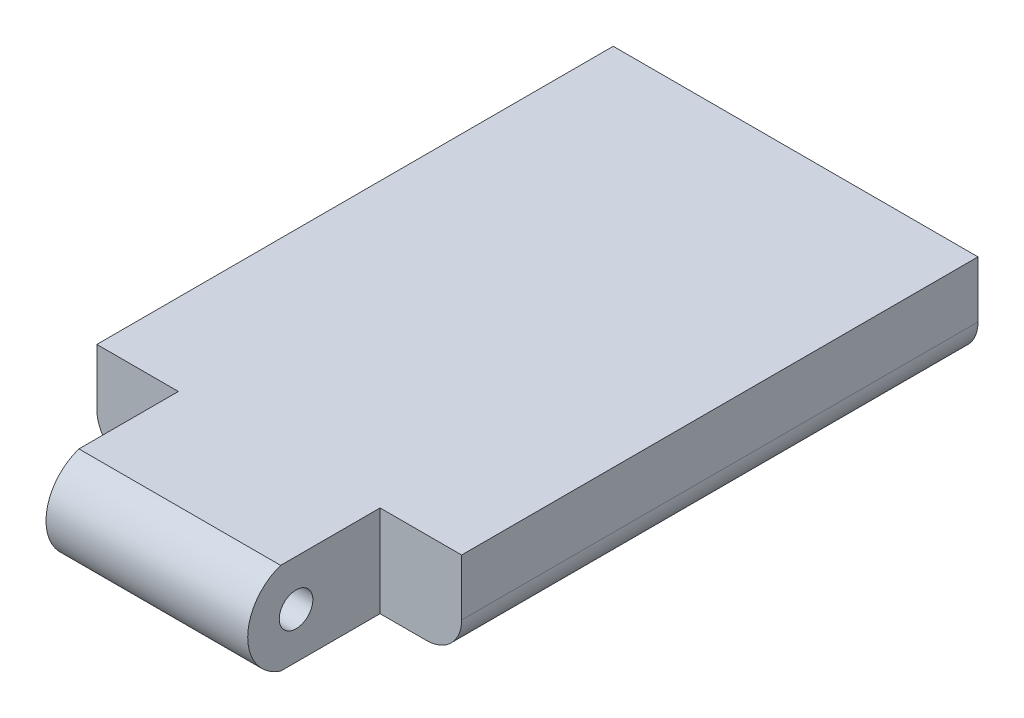
ISO-10303-21;
HEADER;
FILE_DESCRIPTION(('STEP AP214'),'2;1');
FILE_NAME('part.step','',(''),(''),'','','');
FILE_SCHEMA(('AUTOMOTIVE_DESIGN { 1 0 10303 214 1 1 1 1 }'));
ENDSEC;
DATA;
#1=APPLICATION_CONTEXT('core data for automotive mechanical design processes');
#2=APPLICATION_PROTOCOL_DEFINITION('international standard','automotive_design',2000,#1);
#3=PRODUCT_CONTEXT('',#1,'mechanical');
#4=PRODUCT('Part','Part','',(#3));
#5=PRODUCT_RELATED_PRODUCT_CATEGORY('part','',(#4));
#6=PRODUCT_DEFINITION_FORMATION('','',#4);
#7=PRODUCT_DEFINITION_CONTEXT('part definition',#1,'design');
#8=PRODUCT_DEFINITION('design','',#6,#7);
#9=PRODUCT_DEFINITION_SHAPE('','',#8);
#10=(LENGTH_UNIT() NAMED_UNIT(*) SI_UNIT(.MILLI.,.METRE.));
#11=(NAMED_UNIT(*) PLANE_ANGLE_UNIT() SI_UNIT($,.RADIAN.));
#12=(NAMED_UNIT(*) SI_UNIT($,.STERADIAN.) SOLID_ANGLE_UNIT());
#13=UNCERTAINTY_MEASURE_WITH_UNIT(LENGTH_MEASURE(1.E-05),#10,'distance_accuracy_value','');
#14=(GEOMETRIC_REPRESENTATION_CONTEXT(3) GLOBAL_UNCERTAINTY_ASSIGNED_CONTEXT((#13)) GLOBAL_UNIT_ASSIGNED_CONTEXT((#10,
#11,#12)) REPRESENTATION_CONTEXT('',''));
#15=CARTESIAN_POINT('',(0.,0.,0.));
#16=DIRECTION('',(0.,0.,1.));
#17=DIRECTION('',(1.,0.,0.));
#18=AXIS2_PLACEMENT_3D('',#15,#16,#17);
#19=CARTESIAN_POINT('',(-12.,10.75,25.));
#20=DIRECTION('',(1.,0.,0.));
#21=DIRECTION('',(0.,1.,0.));
#22=AXIS2_PLACEMENT_3D('',#19,#20,#21);
#23=CYLINDRICAL_SURFACE('',#22,2.);
#24=CARTESIAN_POINT('',(-12.,10.75,25.));
#25=DIRECTION('',(1.,0.,0.));
#26=DIRECTION('',(0.,1.,0.));
#27=AXIS2_PLACEMENT_3D('',#24,#25,#26);
#28=CIRCLE('',#27,2.);
#29=CARTESIAN_POINT('',(-12.,12.75,25.));
#30=VERTEX_POINT('',#29);
#31=EDGE_CURVE('E179',#30,#30,#28,.T.);
#32=ORIENTED_EDGE('',*,*,#31,.F.);
#33=EDGE_LOOP('',(#32));
#34=FACE_BOUND('',#33,.T.);
#35=CARTESIAN_POINT('',(12.,10.75,25.));
#36=DIRECTION('',(1.,0.,0.));
#37=DIRECTION('',(0.,1.,0.));
#38=AXIS2_PLACEMENT_3D('',#35,#36,#37);
#39=CIRCLE('',#38,2.);
#40=CARTESIAN_POINT('',(12.,12.75,25.));
#41=VERTEX_POINT('',#40);
#42=EDGE_CURVE('E178',#41,#41,#39,.T.);
#43=ORIENTED_EDGE('',*,*,#42,.T.);
#44=EDGE_LOOP('',(#43));
#45=FACE_BOUND('',#44,.T.);
#46=ADVANCED_FACE('F39',(#34,#45),#23,.F.);
#47=CARTESIAN_POINT('',(-12.,10.75,25.));
#48=DIRECTION('',(1.,0.,0.));
#49=DIRECTION('',(0.,1.,0.));
#50=AXIS2_PLACEMENT_3D('',#47,#48,#49);
#51=CYLINDRICAL_SURFACE('',#50,5.75);
#52=CARTESIAN_POINT('',(-12.,10.75,25.));
#53=DIRECTION('',(1.,0.,0.));
#54=DIRECTION('',(0.,-1.,0.));
#55=AXIS2_PLACEMENT_3D('',#52,#53,#54);
#56=CIRCLE('',#55,5.75);
#57=CARTESIAN_POINT('',(-12.,16.2,26.8330302779823));
#58=VERTEX_POINT('',#57);
#59=CARTESIAN_POINT('',(-12.,5.3,26.8330302779823));
#60=VERTEX_POINT('',#59);
#61=EDGE_CURVE('E185',#58,#60,#56,.T.);
#62=ORIENTED_EDGE('',*,*,#61,.T.);
#63=DIRECTION('',(1.,0.,0.));
#64=VECTOR('',#63,1.);
#65=CARTESIAN_POINT('',(-12.,5.3,26.8330302779823));
#66=LINE('',#65,#64);
#67=CARTESIAN_POINT('',(12.,5.30000000000001,26.8330302779823));
#68=VERTEX_POINT('',#67);
#69=EDGE_CURVE('E198',#60,#68,#66,.T.);
#70=ORIENTED_EDGE('',*,*,#69,.T.);
#71=CARTESIAN_POINT('',(12.,10.75,25.));
#72=DIRECTION('',(1.,0.,0.));
#73=DIRECTION('',(0.,-1.,0.));
#74=AXIS2_PLACEMENT_3D('',#71,#72,#73);
#75=CIRCLE('',#74,5.75);
#76=CARTESIAN_POINT('',(12.,16.2,26.8330302779823));
#77=VERTEX_POINT('',#76);
#78=EDGE_CURVE('E182',#77,#68,#75,.T.);
#79=ORIENTED_EDGE('',*,*,#78,.F.);
#80=DIRECTION('',(1.,0.,0.));
#81=VECTOR('',#80,1.);
#82=CARTESIAN_POINT('',(-12.,16.2,26.8330302779823));
#83=LINE('',#82,#81);
#84=EDGE_CURVE('E196',#77,#58,#83,.F.);
#85=ORIENTED_EDGE('',*,*,#84,.T.);
#86=EDGE_LOOP('',(#62,#70,#79,#85));
#87=FACE_BOUND('',#86,.T.);
#88=ADVANCED_FACE('F221',(#87),#51,.T.);
#89=CARTESIAN_POINT('',(-12.,16.5,25.));
#90=DIRECTION('',(1.,0.,0.));
#91=DIRECTION('',(0.,1.,0.));
#92=AXIS2_PLACEMENT_3D('',#89,#90,#91);
#93=PLANE('',#92);
#94=ORIENTED_EDGE('',*,*,#31,.T.);
#95=EDGE_LOOP('',(#94));
#96=FACE_BOUND('',#95,.T.);
#97=DIRECTION('',(0.,0.,-1.));
#98=VECTOR('',#97,1.);
#99=CARTESIAN_POINT('',(-12.,5.3,25.));
#100=LINE('',#99,#98);
#101=CARTESIAN_POINT('',(-12.,5.3,15.));
#102=VERTEX_POINT('',#101);
#103=EDGE_CURVE('E165',#60,#102,#100,.T.);
#104=ORIENTED_EDGE('',*,*,#103,.F.);
#105=ORIENTED_EDGE('',*,*,#61,.F.);
#106=DIRECTION('',(0.,0.,1.));
#107=VECTOR('',#106,1.);
#108=CARTESIAN_POINT('',(-12.,16.2,25.));
#109=LINE('',#108,#107);
#110=CARTESIAN_POINT('',(-12.,16.2,15.));
#111=VERTEX_POINT('',#110);
#112=EDGE_CURVE('E62',#111,#58,#109,.T.);
#113=ORIENTED_EDGE('',*,*,#112,.F.);
#114=DIRECTION('',(0.,-1.,0.));
#115=VECTOR('',#114,1.);
#116=CARTESIAN_POINT('',(-12.,16.5,15.));
#117=LINE('',#116,#115);
#118=EDGE_CURVE('E193',#111,#102,#117,.T.);
#119=ORIENTED_EDGE('',*,*,#118,.T.);
#120=EDGE_LOOP('',(#104,#105,#113,#119));
#121=FACE_BOUND('',#120,.T.);
#122=ADVANCED_FACE('F218',(#96,#121),#93,.F.);
#123=CARTESIAN_POINT('',(12.,16.5,25.));
#124=DIRECTION('',(-1.,0.,0.));
#125=DIRECTION('',(0.,-1.,0.));
#126=AXIS2_PLACEMENT_3D('',#123,#124,#125);
#127=PLANE('',#126);
#128=ORIENTED_EDGE('',*,*,#42,.F.);
#129=EDGE_LOOP('',(#128));
#130=FACE_BOUND('',#129,.T.);
#131=DIRECTION('',(0.,0.,1.));
#132=VECTOR('',#131,1.);
#133=CARTESIAN_POINT('',(12.,5.3,25.));
#134=LINE('',#133,#132);
#135=CARTESIAN_POINT('',(12.,5.3,15.));
#136=VERTEX_POINT('',#135);
#137=EDGE_CURVE('E167',#136,#68,#134,.T.);
#138=ORIENTED_EDGE('',*,*,#137,.F.);
#139=DIRECTION('',(0.,1.,0.));
#140=VECTOR('',#139,1.);
#141=CARTESIAN_POINT('',(12.,16.5,15.));
#142=LINE('',#141,#140);
#143=CARTESIAN_POINT('',(12.,16.2,15.));
#144=VERTEX_POINT('',#143);
#145=EDGE_CURVE('E188',#136,#144,#142,.T.);
#146=ORIENTED_EDGE('',*,*,#145,.T.);
#147=DIRECTION('',(0.,0.,-1.));
#148=VECTOR('',#147,1.);
#149=CARTESIAN_POINT('',(12.,16.2,25.));
#150=LINE('',#149,#148);
#151=EDGE_CURVE('E157',#77,#144,#150,.T.);
#152=ORIENTED_EDGE('',*,*,#151,.F.);
#153=ORIENTED_EDGE('',*,*,#78,.T.);
#154=EDGE_LOOP('',(#138,#146,#152,#153));
#155=FACE_BOUND('',#154,.T.);
#156=ADVANCED_FACE('F226',(#130,#155),#127,.F.);
#157=CARTESIAN_POINT('',(-17.5,9.5,15.));
#158=DIRECTION('',(0.,0.,1.));
#159=DIRECTION('',(1.,0.,0.));
#160=AXIS2_PLACEMENT_3D('',#157,#158,#159);
#161=PLANE('',#160);
#162=CARTESIAN_POINT('',(-17.5,9.5,15.));
#163=DIRECTION('',(0.,0.,1.));
#164=DIRECTION('',(1.,0.,0.));
#165=AXIS2_PLACEMENT_3D('',#162,#163,#164);
#166=CIRCLE('',#165,4.2);
#167=CARTESIAN_POINT('',(-21.7,9.5,15.));
#168=VERTEX_POINT('',#167);
#169=CARTESIAN_POINT('',(-17.5,5.3,15.));
#170=VERTEX_POINT('',#169);
#171=EDGE_CURVE('E11',#168,#170,#166,.T.);
#172=ORIENTED_EDGE('',*,*,#171,.T.);
#173=DIRECTION('',(1.,0.,0.));
#174=VECTOR('',#173,1.);
#175=CARTESIAN_POINT('',(-17.5,5.3,15.));
#176=LINE('',#175,#174);
#177=EDGE_CURVE('E169',#170,#102,#176,.T.);
#178=ORIENTED_EDGE('',*,*,#177,.T.);
#179=ORIENTED_EDGE('',*,*,#118,.F.);
#180=DIRECTION('',(-1.,0.,0.));
#181=VECTOR('',#180,1.);
#182=CARTESIAN_POINT('',(-17.5,16.2,15.));
#183=LINE('',#182,#181);
#184=CARTESIAN_POINT('',(-21.7,16.2,15.));
#185=VERTEX_POINT('',#184);
#186=EDGE_CURVE('E159',#111,#185,#183,.T.);
#187=ORIENTED_EDGE('',*,*,#186,.T.);
#188=DIRECTION('',(0.,-1.,0.));
#189=VECTOR('',#188,1.);
#190=CARTESIAN_POINT('',(-21.7,9.5,15.));
#191=LINE('',#190,#189);
#192=EDGE_CURVE('E47',#185,#168,#191,.T.);
#193=ORIENTED_EDGE('',*,*,#192,.T.);
#194=EDGE_LOOP('',(#172,#178,#179,#187,#193));
#195=FACE_BOUND('',#194,.T.);
#196=ADVANCED_FACE('F202',(#195),#161,.T.);
#197=ORIENTED_EDGE('',*,*,#145,.F.);
#198=DIRECTION('',(1.,0.,0.));
#199=VECTOR('',#198,1.);
#200=CARTESIAN_POINT('',(-17.5,5.3,15.));
#201=LINE('',#200,#199);
#202=CARTESIAN_POINT('',(17.5,5.3,15.));
#203=VERTEX_POINT('',#202);
#204=EDGE_CURVE('E172',#136,#203,#201,.T.);
#205=ORIENTED_EDGE('',*,*,#204,.T.);
#206=CARTESIAN_POINT('',(17.5,9.49999999999995,15.));
#207=DIRECTION('',(0.,0.,1.));
#208=DIRECTION('',(1.,0.,0.));
#209=AXIS2_PLACEMENT_3D('',#206,#207,#208);
#210=CIRCLE('',#209,4.19999999999995);
#211=CARTESIAN_POINT('',(21.7,9.49999999999995,15.));
#212=VERTEX_POINT('',#211);
#213=EDGE_CURVE('E176',#203,#212,#210,.T.);
#214=ORIENTED_EDGE('',*,*,#213,.T.);
#215=DIRECTION('',(0.,1.,0.));
#216=VECTOR('',#215,1.);
#217=CARTESIAN_POINT('',(21.7,9.49999999999998,15.));
#218=LINE('',#217,#216);
#219=CARTESIAN_POINT('',(21.7,16.2,15.));
#220=VERTEX_POINT('',#219);
#221=EDGE_CURVE('E119',#212,#220,#218,.T.);
#222=ORIENTED_EDGE('',*,*,#221,.T.);
#223=DIRECTION('',(-1.,0.,0.));
#224=VECTOR('',#223,1.);
#225=CARTESIAN_POINT('',(-17.5,16.2,15.));
#226=LINE('',#225,#224);
#227=EDGE_CURVE('E162',#220,#144,#226,.T.);
#228=ORIENTED_EDGE('',*,*,#227,.T.);
#229=EDGE_LOOP('',(#197,#205,#214,#222,#228));
#230=FACE_BOUND('',#229,.T.);
#231=ADVANCED_FACE('F41',(#230),#161,.T.);
#232=CARTESIAN_POINT('',(-21.7,9.5,30.75));
#233=DIRECTION('',(-1.,0.,0.));
#234=DIRECTION('',(0.,0.,1.));
#235=AXIS2_PLACEMENT_3D('',#232,#233,#234);
#236=PLANE('',#235);
#237=DIRECTION('',(0.,0.,-1.));
#238=VECTOR('',#237,1.);
#239=CARTESIAN_POINT('',(-21.7,16.2,30.75));
#240=LINE('',#239,#238);
#241=CARTESIAN_POINT('',(-21.7,16.2,-46.4390507884747));
#242=VERTEX_POINT('',#241);
#243=EDGE_CURVE('E148',#185,#242,#240,.T.);
#244=ORIENTED_EDGE('',*,*,#243,.T.);
#245=DIRECTION('',(0.,1.,0.));
#246=VECTOR('',#245,1.);
#247=CARTESIAN_POINT('',(-21.7,9.5,-46.4390507884747));
#248=LINE('',#247,#246);
#249=CARTESIAN_POINT('',(-21.7,9.5,-46.4390507884747));
#250=VERTEX_POINT('',#249);
#251=EDGE_CURVE('E140',#250,#242,#248,.T.);
#252=ORIENTED_EDGE('',*,*,#251,.F.);
#253=DIRECTION('',(0.,0.,-1.));
#254=VECTOR('',#253,1.);
#255=CARTESIAN_POINT('',(-21.7,9.5,30.75));
#256=LINE('',#255,#254);
#257=EDGE_CURVE('E149',#168,#250,#256,.T.);
#258=ORIENTED_EDGE('',*,*,#257,.F.);
#259=ORIENTED_EDGE('',*,*,#192,.F.);
#260=EDGE_LOOP('',(#244,#252,#258,#259));
#261=FACE_BOUND('',#260,.T.);
#262=ADVANCED_FACE('F207',(#261),#236,.T.);
#263=CARTESIAN_POINT('',(-17.5,9.5,30.75));
#264=DIRECTION('',(0.,0.,-1.));
#265=DIRECTION('',(-1.,0.,0.));
#266=AXIS2_PLACEMENT_3D('',#263,#264,#265);
#267=CYLINDRICAL_SURFACE('',#266,4.2);
#268=ORIENTED_EDGE('',*,*,#257,.T.);
#269=CARTESIAN_POINT('',(-17.5,9.5,-46.4390507884747));
#270=DIRECTION('',(0.,0.,-1.));
#271=DIRECTION('',(-1.,0.,0.));
#272=AXIS2_PLACEMENT_3D('',#269,#270,#271);
#273=CIRCLE('',#272,4.2);
#274=CARTESIAN_POINT('',(-17.5,5.3,-46.4390507884747));
#275=VERTEX_POINT('',#274);
#276=EDGE_CURVE('E145',#275,#250,#273,.T.);
#277=ORIENTED_EDGE('',*,*,#276,.F.);
#278=DIRECTION('',(0.,0.,-1.));
#279=VECTOR('',#278,1.);
#280=CARTESIAN_POINT('',(-17.5,5.3,30.75));
#281=LINE('',#280,#279);
#282=EDGE_CURVE('E151',#170,#275,#281,.T.);
#283=ORIENTED_EDGE('',*,*,#282,.F.);
#284=ORIENTED_EDGE('',*,*,#171,.F.);
#285=EDGE_LOOP('',(#268,#277,#283,#284));
#286=FACE_BOUND('',#285,.T.);
#287=ADVANCED_FACE('F213',(#286),#267,.T.);
#288=CARTESIAN_POINT('',(17.5,5.3,30.75));
#289=DIRECTION('',(0.,-1.,0.));
#290=DIRECTION('',(1.,0.,0.));
#291=AXIS2_PLACEMENT_3D('',#288,#289,#290);
#292=PLANE('',#291);
#293=ORIENTED_EDGE('',*,*,#137,.T.);
#294=ORIENTED_EDGE('',*,*,#69,.F.);
#295=ORIENTED_EDGE('',*,*,#103,.T.);
#296=ORIENTED_EDGE('',*,*,#177,.F.);
#297=ORIENTED_EDGE('',*,*,#282,.T.);
#298=DIRECTION('',(-1.,0.,0.));
#299=VECTOR('',#298,1.);
#300=CARTESIAN_POINT('',(17.5,5.3,-46.4390507884747));
#301=LINE('',#300,#299);
#302=CARTESIAN_POINT('',(17.5,5.3,-46.4390507884747));
#303=VERTEX_POINT('',#302);
#304=EDGE_CURVE('E132',#303,#275,#301,.T.);
#305=ORIENTED_EDGE('',*,*,#304,.F.);
#306=DIRECTION('',(0.,0.,-1.));
#307=VECTOR('',#306,1.);
#308=CARTESIAN_POINT('',(17.5,5.3,30.75));
#309=LINE('',#308,#307);
#310=EDGE_CURVE('E122',#203,#303,#309,.T.);
#311=ORIENTED_EDGE('',*,*,#310,.F.);
#312=ORIENTED_EDGE('',*,*,#204,.F.);
#313=EDGE_LOOP('',(#293,#294,#295,#296,#297,#305,#311,#312));
#314=FACE_BOUND('',#313,.T.);
#315=ADVANCED_FACE('F215',(#314),#292,.T.);
#316=CARTESIAN_POINT('',(17.5,9.49999999999995,30.75));
#317=DIRECTION('',(0.,0.,-1.));
#318=DIRECTION('',(-1.,0.,0.));
#319=AXIS2_PLACEMENT_3D('',#316,#317,#318);
#320=CYLINDRICAL_SURFACE('',#319,4.19999999999995);
#321=ORIENTED_EDGE('',*,*,#310,.T.);
#322=CARTESIAN_POINT('',(17.5,9.49999999999995,-46.4390507884747));
#323=DIRECTION('',(0.,0.,-1.));
#324=DIRECTION('',(-1.,0.,0.));
#325=AXIS2_PLACEMENT_3D('',#322,#323,#324);
#326=CIRCLE('',#325,4.19999999999995);
#327=CARTESIAN_POINT('',(21.7,9.49999999999995,-46.4390507884747));
#328=VERTEX_POINT('',#327);
#329=EDGE_CURVE('E126',#328,#303,#326,.T.);
#330=ORIENTED_EDGE('',*,*,#329,.F.);
#331=DIRECTION('',(0.,0.,-1.));
#332=VECTOR('',#331,1.);
#333=CARTESIAN_POINT('',(21.7,9.49999999999995,30.75));
#334=LINE('',#333,#332);
#335=EDGE_CURVE('E115',#212,#328,#334,.T.);
#336=ORIENTED_EDGE('',*,*,#335,.F.);
#337=ORIENTED_EDGE('',*,*,#213,.F.);
#338=EDGE_LOOP('',(#321,#330,#336,#337));
#339=FACE_BOUND('',#338,.T.);
#340=ADVANCED_FACE('F127',(#339),#320,.T.);
#341=CARTESIAN_POINT('',(21.7,16.2,30.75));
#342=DIRECTION('',(1.,0.,0.));
#343=DIRECTION('',(0.,1.,0.));
#344=AXIS2_PLACEMENT_3D('',#341,#342,#343);
#345=PLANE('',#344);
#346=ORIENTED_EDGE('',*,*,#335,.T.);
#347=DIRECTION('',(0.,-1.,0.));
#348=VECTOR('',#347,1.);
#349=CARTESIAN_POINT('',(21.7,16.2,-46.4390507884747));
#350=LINE('',#349,#348);
#351=CARTESIAN_POINT('',(21.7,16.2,-46.4390507884747));
#352=VERTEX_POINT('',#351);
#353=EDGE_CURVE('E54',#352,#328,#350,.T.);
#354=ORIENTED_EDGE('',*,*,#353,.F.);
#355=DIRECTION('',(0.,0.,-1.));
#356=VECTOR('',#355,1.);
#357=CARTESIAN_POINT('',(21.7,16.2,30.75));
#358=LINE('',#357,#356);
#359=EDGE_CURVE('E123',#220,#352,#358,.T.);
#360=ORIENTED_EDGE('',*,*,#359,.F.);
#361=ORIENTED_EDGE('',*,*,#221,.F.);
#362=EDGE_LOOP('',(#346,#354,#360,#361));
#363=FACE_BOUND('',#362,.T.);
#364=ADVANCED_FACE('F117',(#363),#345,.T.);
#365=CARTESIAN_POINT('',(-21.7,16.2,30.75));
#366=DIRECTION('',(0.,1.,0.));
#367=DIRECTION('',(0.,0.,1.));
#368=AXIS2_PLACEMENT_3D('',#365,#366,#367);
#369=PLANE('',#368);
#370=ORIENTED_EDGE('',*,*,#359,.T.);
#371=DIRECTION('',(1.,0.,0.));
#372=VECTOR('',#371,1.);
#373=CARTESIAN_POINT('',(-21.7,16.2,-46.4390507884747));
#374=LINE('',#373,#372);
#375=EDGE_CURVE('E138',#242,#352,#374,.T.);
#376=ORIENTED_EDGE('',*,*,#375,.F.);
#377=ORIENTED_EDGE('',*,*,#243,.F.);
#378=ORIENTED_EDGE('',*,*,#186,.F.);
#379=ORIENTED_EDGE('',*,*,#112,.T.);
#380=ORIENTED_EDGE('',*,*,#84,.F.);
#381=ORIENTED_EDGE('',*,*,#151,.T.);
#382=ORIENTED_EDGE('',*,*,#227,.F.);
#383=EDGE_LOOP('',(#370,#376,#377,#378,#379,#380,#381,#382));
#384=FACE_BOUND('',#383,.T.);
#385=ADVANCED_FACE('F209',(#384),#369,.T.);
#386=CARTESIAN_POINT('',(-17.5,9.5,-46.4390507884747));
#387=DIRECTION('',(0.,0.,1.));
#388=DIRECTION('',(1.,0.,0.));
#389=AXIS2_PLACEMENT_3D('',#386,#387,#388);
#390=PLANE('',#389);
#391=ORIENTED_EDGE('',*,*,#251,.T.);
#392=ORIENTED_EDGE('',*,*,#375,.T.);
#393=ORIENTED_EDGE('',*,*,#353,.T.);
#394=ORIENTED_EDGE('',*,*,#329,.T.);
#395=ORIENTED_EDGE('',*,*,#304,.T.);
#396=ORIENTED_EDGE('',*,*,#276,.T.);
#397=EDGE_LOOP('',(#391,#392,#393,#394,#395,#396));
#398=FACE_BOUND('',#397,.T.);
#399=ADVANCED_FACE('F136',(#398),#390,.F.);
#400=CLOSED_SHELL('',(#46,#88,#122,#156,#196,#231,#262,#287,#315,#340,#364,#385,#399));
#401=MANIFOLD_SOLID_BREP('B2',#400);
#402=ADVANCED_BREP_SHAPE_REPRESENTATION('',(#18,#401),#14);
#403=SHAPE_DEFINITION_REPRESENTATION(#9,#402);
ENDSEC;
END-ISO-10303-21;
